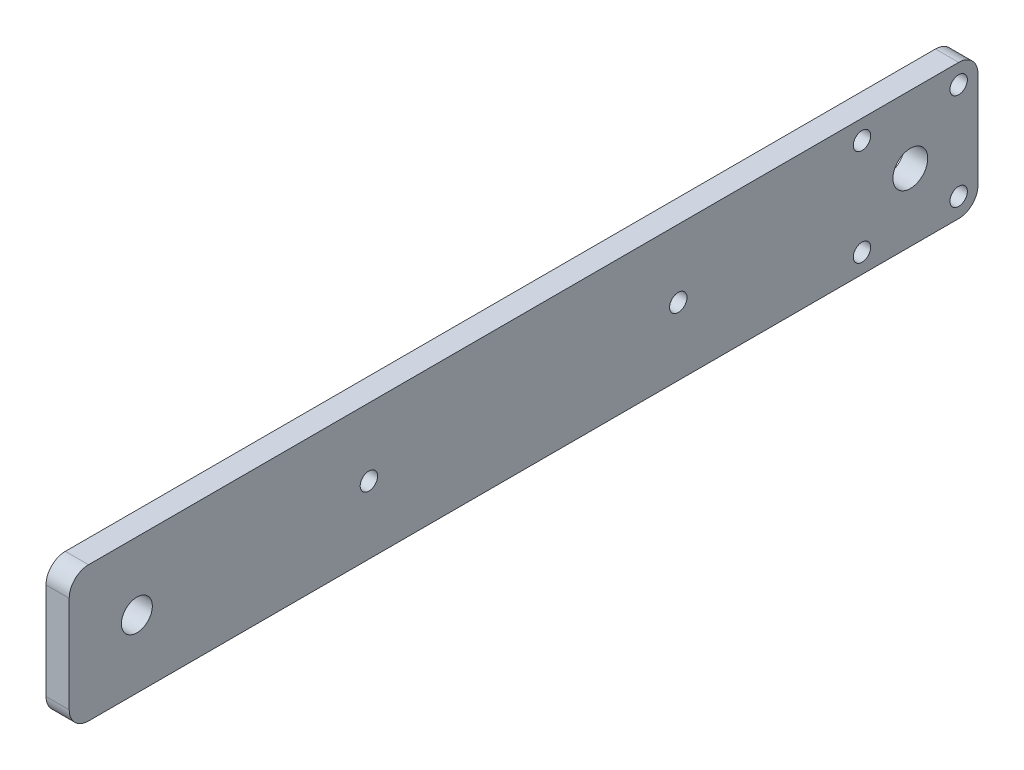
ISO-10303-21;
HEADER;
FILE_DESCRIPTION(('STEP AP214'),'2;1');
FILE_NAME('part.step','',(''),(''),'','','');
FILE_SCHEMA(('AUTOMOTIVE_DESIGN { 1 0 10303 214 1 1 1 1 }'));
ENDSEC;
DATA;
#1=APPLICATION_CONTEXT('core data for automotive mechanical design processes');
#2=APPLICATION_PROTOCOL_DEFINITION('international standard','automotive_design',2000,#1);
#3=PRODUCT_CONTEXT('',#1,'mechanical');
#4=PRODUCT('Part','Part','',(#3));
#5=PRODUCT_RELATED_PRODUCT_CATEGORY('part','',(#4));
#6=PRODUCT_DEFINITION_FORMATION('','',#4);
#7=PRODUCT_DEFINITION_CONTEXT('part definition',#1,'design');
#8=PRODUCT_DEFINITION('design','',#6,#7);
#9=PRODUCT_DEFINITION_SHAPE('','',#8);
#10=(LENGTH_UNIT() NAMED_UNIT(*) SI_UNIT(.MILLI.,.METRE.));
#11=(NAMED_UNIT(*) PLANE_ANGLE_UNIT() SI_UNIT($,.RADIAN.));
#12=(NAMED_UNIT(*) SI_UNIT($,.STERADIAN.) SOLID_ANGLE_UNIT());
#13=UNCERTAINTY_MEASURE_WITH_UNIT(LENGTH_MEASURE(1.E-05),#10,'distance_accuracy_value','');
#14=(GEOMETRIC_REPRESENTATION_CONTEXT(3) GLOBAL_UNCERTAINTY_ASSIGNED_CONTEXT((#13)) GLOBAL_UNIT_ASSIGNED_CONTEXT((#10,
#11,#12)) REPRESENTATION_CONTEXT('',''));
#15=CARTESIAN_POINT('',(0.,0.,0.));
#16=DIRECTION('',(0.,0.,1.));
#17=DIRECTION('',(1.,0.,0.));
#18=AXIS2_PLACEMENT_3D('',#15,#16,#17);
#19=CARTESIAN_POINT('',(3.,0.,0.));
#20=DIRECTION('',(-1.,0.,0.));
#21=DIRECTION('',(0.,0.,1.));
#22=AXIS2_PLACEMENT_3D('',#19,#20,#21);
#23=PLANE('',#22);
#24=CARTESIAN_POINT('',(3.,12.4999999999951,-112.499999999997));
#25=DIRECTION('',(1.,0.,0.));
#26=DIRECTION('',(0.,0.,-1.));
#27=AXIS2_PLACEMENT_3D('',#24,#25,#26);
#28=CIRCLE('',#27,2.25);
#29=CARTESIAN_POINT('',(3.,12.4999999999951,-114.749999999997));
#30=VERTEX_POINT('',#29);
#31=EDGE_CURVE('E206',#30,#30,#28,.T.);
#32=ORIENTED_EDGE('',*,*,#31,.F.);
#33=EDGE_LOOP('',(#32));
#34=FACE_BOUND('',#33,.T.);
#35=DIRECTION('',(0.,0.,-1.));
#36=VECTOR('',#35,1.);
#37=CARTESIAN_POINT('',(3.,-17.5,-117.5));
#38=LINE('',#37,#36);
#39=CARTESIAN_POINT('',(3.,-17.5,112.5));
#40=VERTEX_POINT('',#39);
#41=CARTESIAN_POINT('',(3.,-17.5,-112.5));
#42=VERTEX_POINT('',#41);
#43=EDGE_CURVE('E173',#40,#42,#38,.T.);
#44=ORIENTED_EDGE('',*,*,#43,.T.);
#45=CARTESIAN_POINT('',(3.,-12.5,-112.5));
#46=DIRECTION('',(-1.,0.,0.));
#47=DIRECTION('',(0.,0.,1.));
#48=AXIS2_PLACEMENT_3D('',#45,#46,#47);
#49=CIRCLE('',#48,5.);
#50=CARTESIAN_POINT('',(3.,-12.5,-117.5));
#51=VERTEX_POINT('',#50);
#52=EDGE_CURVE('E150',#42,#51,#49,.F.);
#53=ORIENTED_EDGE('',*,*,#52,.T.);
#54=DIRECTION('',(0.,1.,0.));
#55=VECTOR('',#54,1.);
#56=CARTESIAN_POINT('',(3.,17.5,-117.5));
#57=LINE('',#56,#55);
#58=CARTESIAN_POINT('',(3.,12.5,-117.5));
#59=VERTEX_POINT('',#58);
#60=EDGE_CURVE('E120',#51,#59,#57,.T.);
#61=ORIENTED_EDGE('',*,*,#60,.T.);
#62=CARTESIAN_POINT('',(3.,12.5,-112.5));
#63=DIRECTION('',(-1.,0.,0.));
#64=DIRECTION('',(0.,0.,1.));
#65=AXIS2_PLACEMENT_3D('',#62,#63,#64);
#66=CIRCLE('',#65,5.);
#67=CARTESIAN_POINT('',(3.,17.5,-112.5));
#68=VERTEX_POINT('',#67);
#69=EDGE_CURVE('E57',#59,#68,#66,.F.);
#70=ORIENTED_EDGE('',*,*,#69,.T.);
#71=DIRECTION('',(0.,0.,1.));
#72=VECTOR('',#71,1.);
#73=CARTESIAN_POINT('',(3.,17.5,117.5));
#74=LINE('',#73,#72);
#75=CARTESIAN_POINT('',(3.,17.5,112.5));
#76=VERTEX_POINT('',#75);
#77=EDGE_CURVE('E136',#68,#76,#74,.T.);
#78=ORIENTED_EDGE('',*,*,#77,.T.);
#79=CARTESIAN_POINT('',(3.,12.5,112.5));
#80=DIRECTION('',(-1.,0.,0.));
#81=DIRECTION('',(0.,0.,1.));
#82=AXIS2_PLACEMENT_3D('',#79,#80,#81);
#83=CIRCLE('',#82,5.);
#84=CARTESIAN_POINT('',(3.,12.5,117.5));
#85=VERTEX_POINT('',#84);
#86=EDGE_CURVE('E145',#76,#85,#83,.F.);
#87=ORIENTED_EDGE('',*,*,#86,.T.);
#88=DIRECTION('',(0.,-1.,0.));
#89=VECTOR('',#88,1.);
#90=CARTESIAN_POINT('',(3.,17.5,117.5));
#91=LINE('',#90,#89);
#92=CARTESIAN_POINT('',(3.,-12.5,117.5));
#93=VERTEX_POINT('',#92);
#94=EDGE_CURVE('E130',#85,#93,#91,.T.);
#95=ORIENTED_EDGE('',*,*,#94,.T.);
#96=CARTESIAN_POINT('',(3.,-12.5,112.5));
#97=DIRECTION('',(-1.,0.,0.));
#98=DIRECTION('',(0.,0.,1.));
#99=AXIS2_PLACEMENT_3D('',#96,#97,#98);
#100=CIRCLE('',#99,5.);
#101=EDGE_CURVE('E147',#93,#40,#100,.F.);
#102=ORIENTED_EDGE('',*,*,#101,.T.);
#103=EDGE_LOOP('',(#44,#53,#61,#70,#78,#87,#95,#102));
#104=FACE_BOUND('',#103,.T.);
#105=CARTESIAN_POINT('',(3.,0.,100.));
#106=DIRECTION('',(1.,0.,0.));
#107=DIRECTION('',(0.,0.,-1.));
#108=AXIS2_PLACEMENT_3D('',#105,#106,#107);
#109=CIRCLE('',#108,3.99999999999999);
#110=CARTESIAN_POINT('',(3.,0.,96.));
#111=VERTEX_POINT('',#110);
#112=EDGE_CURVE('E166',#111,#111,#109,.T.);
#113=ORIENTED_EDGE('',*,*,#112,.F.);
#114=EDGE_LOOP('',(#113));
#115=FACE_BOUND('',#114,.T.);
#116=CARTESIAN_POINT('',(3.,0.,-100.));
#117=DIRECTION('',(1.,0.,0.));
#118=DIRECTION('',(0.,0.,-1.));
#119=AXIS2_PLACEMENT_3D('',#116,#117,#118);
#120=CIRCLE('',#119,4.5);
#121=CARTESIAN_POINT('',(3.,0.,-104.5));
#122=VERTEX_POINT('',#121);
#123=EDGE_CURVE('E178',#122,#122,#120,.T.);
#124=ORIENTED_EDGE('',*,*,#123,.F.);
#125=EDGE_LOOP('',(#124));
#126=FACE_BOUND('',#125,.T.);
#127=CARTESIAN_POINT('',(3.,-12.5000000000049,-112.499999999997));
#128=DIRECTION('',(1.,0.,0.));
#129=DIRECTION('',(0.,0.,-1.));
#130=AXIS2_PLACEMENT_3D('',#127,#128,#129);
#131=CIRCLE('',#130,2.25);
#132=CARTESIAN_POINT('',(3.,-12.5000000000049,-114.749999999997));
#133=VERTEX_POINT('',#132);
#134=EDGE_CURVE('E188',#133,#133,#131,.T.);
#135=ORIENTED_EDGE('',*,*,#134,.F.);
#136=EDGE_LOOP('',(#135));
#137=FACE_BOUND('',#136,.T.);
#138=CARTESIAN_POINT('',(3.,-12.5000000000045,-87.4999999999968));
#139=DIRECTION('',(1.,0.,0.));
#140=DIRECTION('',(0.,0.,-1.));
#141=AXIS2_PLACEMENT_3D('',#138,#139,#140);
#142=CIRCLE('',#141,2.25);
#143=CARTESIAN_POINT('',(3.,-12.5000000000045,-89.7499999999968));
#144=VERTEX_POINT('',#143);
#145=EDGE_CURVE('E194',#144,#144,#142,.T.);
#146=ORIENTED_EDGE('',*,*,#145,.F.);
#147=EDGE_LOOP('',(#146));
#148=FACE_BOUND('',#147,.T.);
#149=CARTESIAN_POINT('',(3.,12.4999999999955,-87.4999999999971));
#150=DIRECTION('',(1.,0.,0.));
#151=DIRECTION('',(0.,0.,-1.));
#152=AXIS2_PLACEMENT_3D('',#149,#150,#151);
#153=CIRCLE('',#152,2.25);
#154=CARTESIAN_POINT('',(3.,12.4999999999955,-89.7499999999971));
#155=VERTEX_POINT('',#154);
#156=EDGE_CURVE('E200',#155,#155,#153,.T.);
#157=ORIENTED_EDGE('',*,*,#156,.F.);
#158=EDGE_LOOP('',(#157));
#159=FACE_BOUND('',#158,.T.);
#160=CARTESIAN_POINT('',(3.,0.,-40.));
#161=DIRECTION('',(1.,0.,0.));
#162=DIRECTION('',(0.,0.,-1.));
#163=AXIS2_PLACEMENT_3D('',#160,#161,#162);
#164=CIRCLE('',#163,2.24999999999999);
#165=CARTESIAN_POINT('',(3.,0.,-42.25));
#166=VERTEX_POINT('',#165);
#167=EDGE_CURVE('E212',#166,#166,#164,.T.);
#168=ORIENTED_EDGE('',*,*,#167,.F.);
#169=EDGE_LOOP('',(#168));
#170=FACE_BOUND('',#169,.T.);
#171=CARTESIAN_POINT('',(3.,0.,40.));
#172=DIRECTION('',(1.,0.,0.));
#173=DIRECTION('',(0.,0.,-1.));
#174=AXIS2_PLACEMENT_3D('',#171,#172,#173);
#175=CIRCLE('',#174,2.24999999999999);
#176=CARTESIAN_POINT('',(3.,0.,37.75));
#177=VERTEX_POINT('',#176);
#178=EDGE_CURVE('E218',#177,#177,#175,.T.);
#179=ORIENTED_EDGE('',*,*,#178,.F.);
#180=EDGE_LOOP('',(#179));
#181=FACE_BOUND('',#180,.T.);
#182=ADVANCED_FACE('F35',(#34,#104,#115,#126,#137,#148,#159,#170,#181),#23,.F.);
#183=CARTESIAN_POINT('',(-3.,0.,0.));
#184=DIRECTION('',(-1.,0.,0.));
#185=DIRECTION('',(0.,0.,1.));
#186=AXIS2_PLACEMENT_3D('',#183,#184,#185);
#187=PLANE('',#186);
#188=CARTESIAN_POINT('',(-3.,0.,40.));
#189=DIRECTION('',(-1.,0.,0.));
#190=DIRECTION('',(0.,0.,1.));
#191=AXIS2_PLACEMENT_3D('',#188,#189,#190);
#192=CIRCLE('',#191,2.24999999999999);
#193=CARTESIAN_POINT('',(-3.,0.,42.25));
#194=VERTEX_POINT('',#193);
#195=EDGE_CURVE('E215',#194,#194,#192,.T.);
#196=ORIENTED_EDGE('',*,*,#195,.F.);
#197=EDGE_LOOP('',(#196));
#198=FACE_BOUND('',#197,.T.);
#199=CARTESIAN_POINT('',(-3.,0.,-40.));
#200=DIRECTION('',(-1.,0.,0.));
#201=DIRECTION('',(0.,0.,1.));
#202=AXIS2_PLACEMENT_3D('',#199,#200,#201);
#203=CIRCLE('',#202,2.24999999999999);
#204=CARTESIAN_POINT('',(-3.,0.,-37.75));
#205=VERTEX_POINT('',#204);
#206=EDGE_CURVE('E209',#205,#205,#203,.T.);
#207=ORIENTED_EDGE('',*,*,#206,.F.);
#208=EDGE_LOOP('',(#207));
#209=FACE_BOUND('',#208,.T.);
#210=CARTESIAN_POINT('',(-3.,12.4999999999951,-112.499999999997));
#211=DIRECTION('',(-1.,0.,0.));
#212=DIRECTION('',(0.,0.,1.));
#213=AXIS2_PLACEMENT_3D('',#210,#211,#212);
#214=CIRCLE('',#213,2.25);
#215=CARTESIAN_POINT('',(-3.,12.4999999999951,-110.249999999997));
#216=VERTEX_POINT('',#215);
#217=EDGE_CURVE('E203',#216,#216,#214,.T.);
#218=ORIENTED_EDGE('',*,*,#217,.F.);
#219=EDGE_LOOP('',(#218));
#220=FACE_BOUND('',#219,.T.);
#221=CARTESIAN_POINT('',(-3.,12.4999999999955,-87.4999999999971));
#222=DIRECTION('',(-1.,0.,0.));
#223=DIRECTION('',(0.,0.,1.));
#224=AXIS2_PLACEMENT_3D('',#221,#222,#223);
#225=CIRCLE('',#224,2.25);
#226=CARTESIAN_POINT('',(-3.,12.4999999999955,-85.2499999999971));
#227=VERTEX_POINT('',#226);
#228=EDGE_CURVE('E197',#227,#227,#225,.T.);
#229=ORIENTED_EDGE('',*,*,#228,.F.);
#230=EDGE_LOOP('',(#229));
#231=FACE_BOUND('',#230,.T.);
#232=CARTESIAN_POINT('',(-3.,-12.5000000000045,-87.4999999999968));
#233=DIRECTION('',(-1.,0.,0.));
#234=DIRECTION('',(0.,0.,1.));
#235=AXIS2_PLACEMENT_3D('',#232,#233,#234);
#236=CIRCLE('',#235,2.25);
#237=CARTESIAN_POINT('',(-3.,-12.5000000000045,-85.2499999999968));
#238=VERTEX_POINT('',#237);
#239=EDGE_CURVE('E191',#238,#238,#236,.T.);
#240=ORIENTED_EDGE('',*,*,#239,.F.);
#241=EDGE_LOOP('',(#240));
#242=FACE_BOUND('',#241,.T.);
#243=CARTESIAN_POINT('',(-3.,-12.5000000000049,-112.499999999997));
#244=DIRECTION('',(-1.,0.,0.));
#245=DIRECTION('',(0.,0.,1.));
#246=AXIS2_PLACEMENT_3D('',#243,#244,#245);
#247=CIRCLE('',#246,2.25);
#248=CARTESIAN_POINT('',(-3.,-12.5000000000049,-110.249999999997));
#249=VERTEX_POINT('',#248);
#250=EDGE_CURVE('E183',#249,#249,#247,.T.);
#251=ORIENTED_EDGE('',*,*,#250,.F.);
#252=EDGE_LOOP('',(#251));
#253=FACE_BOUND('',#252,.T.);
#254=CARTESIAN_POINT('',(-3.,0.,100.));
#255=DIRECTION('',(1.,0.,0.));
#256=DIRECTION('',(0.,0.,-1.));
#257=AXIS2_PLACEMENT_3D('',#254,#255,#256);
#258=CIRCLE('',#257,3.99999999999999);
#259=CARTESIAN_POINT('',(-3.,0.,96.));
#260=VERTEX_POINT('',#259);
#261=EDGE_CURVE('E168',#260,#260,#258,.T.);
#262=ORIENTED_EDGE('',*,*,#261,.T.);
#263=EDGE_LOOP('',(#262));
#264=FACE_BOUND('',#263,.T.);
#265=DIRECTION('',(0.,1.,0.));
#266=VECTOR('',#265,1.);
#267=CARTESIAN_POINT('',(-3.,17.5,-117.5));
#268=LINE('',#267,#266);
#269=CARTESIAN_POINT('',(-3.,-12.5,-117.5));
#270=VERTEX_POINT('',#269);
#271=CARTESIAN_POINT('',(-3.,12.5,-117.5));
#272=VERTEX_POINT('',#271);
#273=EDGE_CURVE('E118',#270,#272,#268,.T.);
#274=ORIENTED_EDGE('',*,*,#273,.F.);
#275=CARTESIAN_POINT('',(-3.,-12.5,-112.5));
#276=DIRECTION('',(-1.,0.,0.));
#277=DIRECTION('',(0.,0.,1.));
#278=AXIS2_PLACEMENT_3D('',#275,#276,#277);
#279=CIRCLE('',#278,5.);
#280=CARTESIAN_POINT('',(-3.,-17.5,-112.5));
#281=VERTEX_POINT('',#280);
#282=EDGE_CURVE('E101',#270,#281,#279,.T.);
#283=ORIENTED_EDGE('',*,*,#282,.T.);
#284=DIRECTION('',(0.,0.,-1.));
#285=VECTOR('',#284,1.);
#286=CARTESIAN_POINT('',(-3.,-17.5,-117.5));
#287=LINE('',#286,#285);
#288=CARTESIAN_POINT('',(-3.,-17.5,112.5));
#289=VERTEX_POINT('',#288);
#290=EDGE_CURVE('E128',#289,#281,#287,.T.);
#291=ORIENTED_EDGE('',*,*,#290,.F.);
#292=CARTESIAN_POINT('',(-3.,-12.5,112.5));
#293=DIRECTION('',(-1.,0.,0.));
#294=DIRECTION('',(0.,0.,1.));
#295=AXIS2_PLACEMENT_3D('',#292,#293,#294);
#296=CIRCLE('',#295,5.);
#297=CARTESIAN_POINT('',(-3.,-12.5,117.5));
#298=VERTEX_POINT('',#297);
#299=EDGE_CURVE('E139',#289,#298,#296,.T.);
#300=ORIENTED_EDGE('',*,*,#299,.T.);
#301=DIRECTION('',(0.,-1.,0.));
#302=VECTOR('',#301,1.);
#303=CARTESIAN_POINT('',(-3.,17.5,117.5));
#304=LINE('',#303,#302);
#305=CARTESIAN_POINT('',(-3.,12.5,117.5));
#306=VERTEX_POINT('',#305);
#307=EDGE_CURVE('E132',#306,#298,#304,.T.);
#308=ORIENTED_EDGE('',*,*,#307,.F.);
#309=CARTESIAN_POINT('',(-3.,12.5,112.5));
#310=DIRECTION('',(-1.,0.,0.));
#311=DIRECTION('',(0.,0.,1.));
#312=AXIS2_PLACEMENT_3D('',#309,#310,#311);
#313=CIRCLE('',#312,5.);
#314=CARTESIAN_POINT('',(-3.,17.5,112.5));
#315=VERTEX_POINT('',#314);
#316=EDGE_CURVE('E121',#306,#315,#313,.T.);
#317=ORIENTED_EDGE('',*,*,#316,.T.);
#318=DIRECTION('',(0.,0.,1.));
#319=VECTOR('',#318,1.);
#320=CARTESIAN_POINT('',(-3.,17.5,117.5));
#321=LINE('',#320,#319);
#322=CARTESIAN_POINT('',(-3.,17.5,-112.5));
#323=VERTEX_POINT('',#322);
#324=EDGE_CURVE('E127',#323,#315,#321,.T.);
#325=ORIENTED_EDGE('',*,*,#324,.F.);
#326=CARTESIAN_POINT('',(-3.,12.5,-112.5));
#327=DIRECTION('',(-1.,0.,0.));
#328=DIRECTION('',(0.,0.,1.));
#329=AXIS2_PLACEMENT_3D('',#326,#327,#328);
#330=CIRCLE('',#329,5.);
#331=EDGE_CURVE('E112',#323,#272,#330,.T.);
#332=ORIENTED_EDGE('',*,*,#331,.T.);
#333=EDGE_LOOP('',(#274,#283,#291,#300,#308,#317,#325,#332));
#334=FACE_BOUND('',#333,.T.);
#335=CARTESIAN_POINT('',(-3.,0.,-100.));
#336=DIRECTION('',(1.,0.,0.));
#337=DIRECTION('',(0.,0.,-1.));
#338=AXIS2_PLACEMENT_3D('',#335,#336,#337);
#339=CIRCLE('',#338,4.5);
#340=CARTESIAN_POINT('',(-3.,0.,-104.5));
#341=VERTEX_POINT('',#340);
#342=EDGE_CURVE('E180',#341,#341,#339,.T.);
#343=ORIENTED_EDGE('',*,*,#342,.T.);
#344=EDGE_LOOP('',(#343));
#345=FACE_BOUND('',#344,.T.);
#346=ADVANCED_FACE('F124',(#198,#209,#220,#231,#242,#253,#264,#334,#345),#187,.T.);
#347=CARTESIAN_POINT('',(3.,17.5,117.5));
#348=DIRECTION('',(0.,0.,-1.));
#349=DIRECTION('',(-1.,0.,0.));
#350=AXIS2_PLACEMENT_3D('',#347,#348,#349);
#351=PLANE('',#350);
#352=ORIENTED_EDGE('',*,*,#307,.T.);
#353=DIRECTION('',(-1.,0.,0.));
#354=VECTOR('',#353,1.);
#355=CARTESIAN_POINT('',(3.,-12.5,117.5));
#356=LINE('',#355,#354);
#357=EDGE_CURVE('E11',#298,#93,#356,.F.);
#358=ORIENTED_EDGE('',*,*,#357,.T.);
#359=ORIENTED_EDGE('',*,*,#94,.F.);
#360=DIRECTION('',(-1.,0.,0.));
#361=VECTOR('',#360,1.);
#362=CARTESIAN_POINT('',(3.,12.5,117.5));
#363=LINE('',#362,#361);
#364=EDGE_CURVE('E43',#85,#306,#363,.T.);
#365=ORIENTED_EDGE('',*,*,#364,.T.);
#366=EDGE_LOOP('',(#352,#358,#359,#365));
#367=FACE_BOUND('',#366,.T.);
#368=ADVANCED_FACE('F161',(#367),#351,.F.);
#369=CARTESIAN_POINT('',(3.,-17.5,-117.5));
#370=DIRECTION('',(0.,1.,0.));
#371=DIRECTION('',(0.,0.,1.));
#372=AXIS2_PLACEMENT_3D('',#369,#370,#371);
#373=PLANE('',#372);
#374=ORIENTED_EDGE('',*,*,#290,.T.);
#375=DIRECTION('',(-1.,0.,0.));
#376=VECTOR('',#375,1.);
#377=CARTESIAN_POINT('',(3.,-17.5,-112.5));
#378=LINE('',#377,#376);
#379=EDGE_CURVE('E106',#281,#42,#378,.F.);
#380=ORIENTED_EDGE('',*,*,#379,.T.);
#381=ORIENTED_EDGE('',*,*,#43,.F.);
#382=DIRECTION('',(-1.,0.,0.));
#383=VECTOR('',#382,1.);
#384=CARTESIAN_POINT('',(3.,-17.5,112.5));
#385=LINE('',#384,#383);
#386=EDGE_CURVE('E111',#40,#289,#385,.T.);
#387=ORIENTED_EDGE('',*,*,#386,.T.);
#388=EDGE_LOOP('',(#374,#380,#381,#387));
#389=FACE_BOUND('',#388,.T.);
#390=ADVANCED_FACE('F244',(#389),#373,.F.);
#391=CARTESIAN_POINT('',(3.,17.5,-117.5));
#392=DIRECTION('',(0.,0.,1.));
#393=DIRECTION('',(1.,0.,0.));
#394=AXIS2_PLACEMENT_3D('',#391,#392,#393);
#395=PLANE('',#394);
#396=ORIENTED_EDGE('',*,*,#60,.F.);
#397=DIRECTION('',(-1.,0.,0.));
#398=VECTOR('',#397,1.);
#399=CARTESIAN_POINT('',(3.,-12.5,-117.5));
#400=LINE('',#399,#398);
#401=EDGE_CURVE('E105',#51,#270,#400,.T.);
#402=ORIENTED_EDGE('',*,*,#401,.T.);
#403=ORIENTED_EDGE('',*,*,#273,.T.);
#404=DIRECTION('',(-1.,0.,0.));
#405=VECTOR('',#404,1.);
#406=CARTESIAN_POINT('',(3.,12.5,-117.5));
#407=LINE('',#406,#405);
#408=EDGE_CURVE('E122',#272,#59,#407,.F.);
#409=ORIENTED_EDGE('',*,*,#408,.T.);
#410=EDGE_LOOP('',(#396,#402,#403,#409));
#411=FACE_BOUND('',#410,.T.);
#412=ADVANCED_FACE('F117',(#411),#395,.F.);
#413=CARTESIAN_POINT('',(3.,17.5,117.5));
#414=DIRECTION('',(0.,-1.,0.));
#415=DIRECTION('',(0.,0.,-1.));
#416=AXIS2_PLACEMENT_3D('',#413,#414,#415);
#417=PLANE('',#416);
#418=ORIENTED_EDGE('',*,*,#77,.F.);
#419=DIRECTION('',(-1.,0.,0.));
#420=VECTOR('',#419,1.);
#421=CARTESIAN_POINT('',(3.,17.5,-112.5));
#422=LINE('',#421,#420);
#423=EDGE_CURVE('E153',#68,#323,#422,.T.);
#424=ORIENTED_EDGE('',*,*,#423,.T.);
#425=ORIENTED_EDGE('',*,*,#324,.T.);
#426=DIRECTION('',(-1.,0.,0.));
#427=VECTOR('',#426,1.);
#428=CARTESIAN_POINT('',(3.,17.5,112.5));
#429=LINE('',#428,#427);
#430=EDGE_CURVE('E50',#315,#76,#429,.F.);
#431=ORIENTED_EDGE('',*,*,#430,.T.);
#432=EDGE_LOOP('',(#418,#424,#425,#431));
#433=FACE_BOUND('',#432,.T.);
#434=ADVANCED_FACE('F239',(#433),#417,.F.);
#435=CARTESIAN_POINT('',(3.,0.,100.));
#436=DIRECTION('',(-1.,0.,0.));
#437=DIRECTION('',(0.,0.,1.));
#438=AXIS2_PLACEMENT_3D('',#435,#436,#437);
#439=CYLINDRICAL_SURFACE('',#438,3.99999999999999);
#440=ORIENTED_EDGE('',*,*,#112,.T.);
#441=EDGE_LOOP('',(#440));
#442=FACE_BOUND('',#441,.T.);
#443=ORIENTED_EDGE('',*,*,#261,.F.);
#444=EDGE_LOOP('',(#443));
#445=FACE_BOUND('',#444,.T.);
#446=ADVANCED_FACE('F236',(#442,#445),#439,.F.);
#447=CARTESIAN_POINT('',(3.,0.,-100.));
#448=DIRECTION('',(-1.,0.,0.));
#449=DIRECTION('',(0.,0.,1.));
#450=AXIS2_PLACEMENT_3D('',#447,#448,#449);
#451=CYLINDRICAL_SURFACE('',#450,4.5);
#452=ORIENTED_EDGE('',*,*,#123,.T.);
#453=EDGE_LOOP('',(#452));
#454=FACE_BOUND('',#453,.T.);
#455=ORIENTED_EDGE('',*,*,#342,.F.);
#456=EDGE_LOOP('',(#455));
#457=FACE_BOUND('',#456,.T.);
#458=ADVANCED_FACE('F253',(#454,#457),#451,.F.);
#459=CARTESIAN_POINT('',(3.,-12.5,-112.5));
#460=DIRECTION('',(-1.,0.,0.));
#461=DIRECTION('',(0.,0.,1.));
#462=AXIS2_PLACEMENT_3D('',#459,#460,#461);
#463=CYLINDRICAL_SURFACE('',#462,5.);
#464=ORIENTED_EDGE('',*,*,#52,.F.);
#465=ORIENTED_EDGE('',*,*,#379,.F.);
#466=ORIENTED_EDGE('',*,*,#282,.F.);
#467=ORIENTED_EDGE('',*,*,#401,.F.);
#468=EDGE_LOOP('',(#464,#465,#466,#467));
#469=FACE_BOUND('',#468,.T.);
#470=ADVANCED_FACE('F104',(#469),#463,.T.);
#471=CARTESIAN_POINT('',(3.,12.5,-112.5));
#472=DIRECTION('',(-1.,0.,0.));
#473=DIRECTION('',(0.,0.,1.));
#474=AXIS2_PLACEMENT_3D('',#471,#472,#473);
#475=CYLINDRICAL_SURFACE('',#474,5.);
#476=ORIENTED_EDGE('',*,*,#69,.F.);
#477=ORIENTED_EDGE('',*,*,#408,.F.);
#478=ORIENTED_EDGE('',*,*,#331,.F.);
#479=ORIENTED_EDGE('',*,*,#423,.F.);
#480=EDGE_LOOP('',(#476,#477,#478,#479));
#481=FACE_BOUND('',#480,.T.);
#482=ADVANCED_FACE('F252',(#481),#475,.T.);
#483=CARTESIAN_POINT('',(3.,-12.5,112.5));
#484=DIRECTION('',(-1.,0.,0.));
#485=DIRECTION('',(0.,0.,1.));
#486=AXIS2_PLACEMENT_3D('',#483,#484,#485);
#487=CYLINDRICAL_SURFACE('',#486,5.);
#488=ORIENTED_EDGE('',*,*,#101,.F.);
#489=ORIENTED_EDGE('',*,*,#357,.F.);
#490=ORIENTED_EDGE('',*,*,#299,.F.);
#491=ORIENTED_EDGE('',*,*,#386,.F.);
#492=EDGE_LOOP('',(#488,#489,#490,#491));
#493=FACE_BOUND('',#492,.T.);
#494=ADVANCED_FACE('F255',(#493),#487,.T.);
#495=CARTESIAN_POINT('',(3.,12.5,112.5));
#496=DIRECTION('',(-1.,0.,0.));
#497=DIRECTION('',(0.,0.,1.));
#498=AXIS2_PLACEMENT_3D('',#495,#496,#497);
#499=CYLINDRICAL_SURFACE('',#498,5.);
#500=ORIENTED_EDGE('',*,*,#86,.F.);
#501=ORIENTED_EDGE('',*,*,#430,.F.);
#502=ORIENTED_EDGE('',*,*,#316,.F.);
#503=ORIENTED_EDGE('',*,*,#364,.F.);
#504=EDGE_LOOP('',(#500,#501,#502,#503));
#505=FACE_BOUND('',#504,.T.);
#506=ADVANCED_FACE('F37',(#505),#499,.T.);
#507=CARTESIAN_POINT('',(3.,-12.5000000000049,-112.499999999997));
#508=DIRECTION('',(1.,0.,0.));
#509=DIRECTION('',(0.,0.,-1.));
#510=AXIS2_PLACEMENT_3D('',#507,#508,#509);
#511=CYLINDRICAL_SURFACE('',#510,2.25);
#512=ORIENTED_EDGE('',*,*,#134,.T.);
#513=EDGE_LOOP('',(#512));
#514=FACE_BOUND('',#513,.T.);
#515=ORIENTED_EDGE('',*,*,#250,.T.);
#516=EDGE_LOOP('',(#515));
#517=FACE_BOUND('',#516,.T.);
#518=ADVANCED_FACE('F262',(#514,#517),#511,.F.);
#519=CARTESIAN_POINT('',(3.,-12.5000000000045,-87.4999999999968));
#520=DIRECTION('',(1.,0.,0.));
#521=DIRECTION('',(0.,0.,-1.));
#522=AXIS2_PLACEMENT_3D('',#519,#520,#521);
#523=CYLINDRICAL_SURFACE('',#522,2.25);
#524=ORIENTED_EDGE('',*,*,#145,.T.);
#525=EDGE_LOOP('',(#524));
#526=FACE_BOUND('',#525,.T.);
#527=ORIENTED_EDGE('',*,*,#239,.T.);
#528=EDGE_LOOP('',(#527));
#529=FACE_BOUND('',#528,.T.);
#530=ADVANCED_FACE('F310',(#526,#529),#523,.F.);
#531=CARTESIAN_POINT('',(3.,12.4999999999955,-87.4999999999971));
#532=DIRECTION('',(1.,0.,0.));
#533=DIRECTION('',(0.,0.,-1.));
#534=AXIS2_PLACEMENT_3D('',#531,#532,#533);
#535=CYLINDRICAL_SURFACE('',#534,2.25);
#536=ORIENTED_EDGE('',*,*,#156,.T.);
#537=EDGE_LOOP('',(#536));
#538=FACE_BOUND('',#537,.T.);
#539=ORIENTED_EDGE('',*,*,#228,.T.);
#540=EDGE_LOOP('',(#539));
#541=FACE_BOUND('',#540,.T.);
#542=ADVANCED_FACE('F314',(#538,#541),#535,.F.);
#543=CARTESIAN_POINT('',(3.,12.4999999999951,-112.499999999997));
#544=DIRECTION('',(1.,0.,0.));
#545=DIRECTION('',(0.,0.,-1.));
#546=AXIS2_PLACEMENT_3D('',#543,#544,#545);
#547=CYLINDRICAL_SURFACE('',#546,2.25);
#548=ORIENTED_EDGE('',*,*,#31,.T.);
#549=EDGE_LOOP('',(#548));
#550=FACE_BOUND('',#549,.T.);
#551=ORIENTED_EDGE('',*,*,#217,.T.);
#552=EDGE_LOOP('',(#551));
#553=FACE_BOUND('',#552,.T.);
#554=ADVANCED_FACE('F283',(#550,#553),#547,.F.);
#555=CARTESIAN_POINT('',(3.,0.,-40.));
#556=DIRECTION('',(1.,0.,0.));
#557=DIRECTION('',(0.,0.,-1.));
#558=AXIS2_PLACEMENT_3D('',#555,#556,#557);
#559=CYLINDRICAL_SURFACE('',#558,2.24999999999999);
#560=ORIENTED_EDGE('',*,*,#167,.T.);
#561=EDGE_LOOP('',(#560));
#562=FACE_BOUND('',#561,.T.);
#563=ORIENTED_EDGE('',*,*,#206,.T.);
#564=EDGE_LOOP('',(#563));
#565=FACE_BOUND('',#564,.T.);
#566=ADVANCED_FACE('F280',(#562,#565),#559,.F.);
#567=CARTESIAN_POINT('',(3.,0.,40.));
#568=DIRECTION('',(1.,0.,0.));
#569=DIRECTION('',(0.,0.,-1.));
#570=AXIS2_PLACEMENT_3D('',#567,#568,#569);
#571=CYLINDRICAL_SURFACE('',#570,2.24999999999999);
#572=ORIENTED_EDGE('',*,*,#178,.T.);
#573=EDGE_LOOP('',(#572));
#574=FACE_BOUND('',#573,.T.);
#575=ORIENTED_EDGE('',*,*,#195,.T.);
#576=EDGE_LOOP('',(#575));
#577=FACE_BOUND('',#576,.T.);
#578=ADVANCED_FACE('F222',(#574,#577),#571,.F.);
#579=CLOSED_SHELL('',(#182,#346,#368,#390,#412,#434,#446,#458,#470,#482,#494,#506,#518,#530,
#542,#554,#566,#578));
#580=MANIFOLD_SOLID_BREP('B2',#579);
#581=ADVANCED_BREP_SHAPE_REPRESENTATION('',(#18,#580),#14);
#582=SHAPE_DEFINITION_REPRESENTATION(#9,#581);
ENDSEC;
END-ISO-10303-21;
